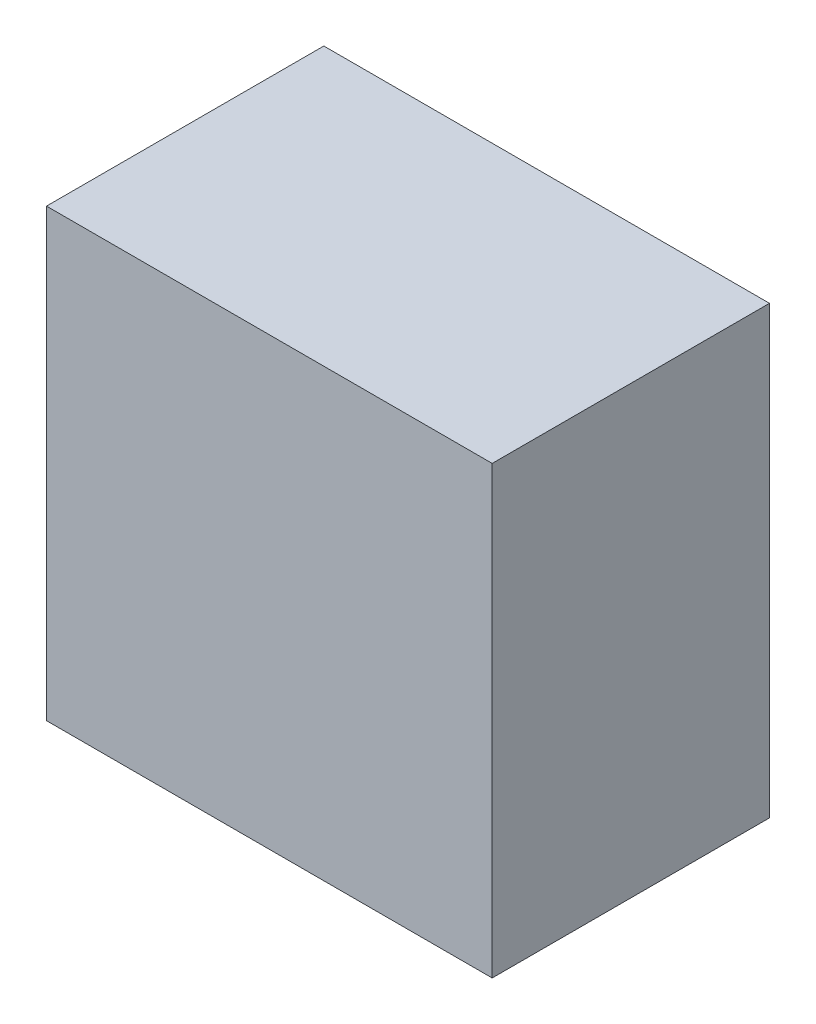
ISO-10303-21;
HEADER;
FILE_DESCRIPTION(('STEP AP214'),'2;1');
FILE_NAME('part.step','',(''),(''),'','','');
FILE_SCHEMA(('AUTOMOTIVE_DESIGN { 1 0 10303 214 1 1 1 1 }'));
ENDSEC;
DATA;
#1=APPLICATION_CONTEXT('core data for automotive mechanical design processes');
#2=APPLICATION_PROTOCOL_DEFINITION('international standard','automotive_design',2000,#1);
#3=PRODUCT_CONTEXT('',#1,'mechanical');
#4=PRODUCT('Part','Part','',(#3));
#5=PRODUCT_RELATED_PRODUCT_CATEGORY('part','',(#4));
#6=PRODUCT_DEFINITION_FORMATION('','',#4);
#7=PRODUCT_DEFINITION_CONTEXT('part definition',#1,'design');
#8=PRODUCT_DEFINITION('design','',#6,#7);
#9=PRODUCT_DEFINITION_SHAPE('','',#8);
#10=(LENGTH_UNIT() NAMED_UNIT(*) SI_UNIT(.MILLI.,.METRE.));
#11=(NAMED_UNIT(*) PLANE_ANGLE_UNIT() SI_UNIT($,.RADIAN.));
#12=(NAMED_UNIT(*) SI_UNIT($,.STERADIAN.) SOLID_ANGLE_UNIT());
#13=UNCERTAINTY_MEASURE_WITH_UNIT(LENGTH_MEASURE(1.E-05),#10,'distance_accuracy_value','');
#14=(GEOMETRIC_REPRESENTATION_CONTEXT(3) GLOBAL_UNCERTAINTY_ASSIGNED_CONTEXT((#13)) GLOBAL_UNIT_ASSIGNED_CONTEXT((#10,
#11,#12)) REPRESENTATION_CONTEXT('',''));
#15=CARTESIAN_POINT('',(0.,0.,0.));
#16=DIRECTION('',(0.,0.,1.));
#17=DIRECTION('',(1.,0.,0.));
#18=AXIS2_PLACEMENT_3D('',#15,#16,#17);
#19=CARTESIAN_POINT('',(-5.62500018,-5.62500018,7.00000124));
#20=DIRECTION('',(0.,0.,1.));
#21=DIRECTION('',(1.,0.,0.));
#22=AXIS2_PLACEMENT_3D('',#19,#20,#21);
#23=PLANE('',#22);
#24=DIRECTION('',(1.,0.,0.));
#25=VECTOR('',#24,1.);
#26=CARTESIAN_POINT('',(-5.62500018,5.62500018,7.00000124));
#27=LINE('',#26,#25);
#28=CARTESIAN_POINT('',(-5.62500018,5.62500018,7.00000124));
#29=VERTEX_POINT('',#28);
#30=CARTESIAN_POINT('',(5.62500018,5.62500018,7.00000124));
#31=VERTEX_POINT('',#30);
#32=EDGE_CURVE('E53',#29,#31,#27,.T.);
#33=ORIENTED_EDGE('',*,*,#32,.F.);
#34=DIRECTION('',(0.,1.,0.));
#35=VECTOR('',#34,1.);
#36=CARTESIAN_POINT('',(-5.62500018,-5.62500018,7.00000124));
#37=LINE('',#36,#35);
#38=CARTESIAN_POINT('',(-5.62500018,-5.62500018,7.00000124));
#39=VERTEX_POINT('',#38);
#40=EDGE_CURVE('E68',#39,#29,#37,.T.);
#41=ORIENTED_EDGE('',*,*,#40,.F.);
#42=DIRECTION('',(1.,0.,0.));
#43=VECTOR('',#42,1.);
#44=CARTESIAN_POINT('',(5.62500018,-5.62500018,7.00000124));
#45=LINE('',#44,#43);
#46=CARTESIAN_POINT('',(5.62500018,-5.62500018,7.00000124));
#47=VERTEX_POINT('',#46);
#48=EDGE_CURVE('E20',#47,#39,#45,.F.);
#49=ORIENTED_EDGE('',*,*,#48,.F.);
#50=DIRECTION('',(0.,1.,0.));
#51=VECTOR('',#50,1.);
#52=CARTESIAN_POINT('',(5.62500018,5.62500018,7.00000124));
#53=LINE('',#52,#51);
#54=EDGE_CURVE('E58',#31,#47,#53,.F.);
#55=ORIENTED_EDGE('',*,*,#54,.F.);
#56=EDGE_LOOP('',(#33,#41,#49,#55));
#57=FACE_BOUND('',#56,.T.);
#58=ADVANCED_FACE('F17',(#57),#23,.T.);
#59=CARTESIAN_POINT('',(5.62500018,-5.62500018,0.));
#60=DIRECTION('',(0.,-1.,0.));
#61=DIRECTION('',(0.,0.,-1.));
#62=AXIS2_PLACEMENT_3D('',#59,#60,#61);
#63=PLANE('',#62);
#64=DIRECTION('',(0.,0.,1.));
#65=VECTOR('',#64,1.);
#66=CARTESIAN_POINT('',(-5.62500018,-5.62500018,0.));
#67=LINE('',#66,#65);
#68=CARTESIAN_POINT('',(-5.62500018,-5.62500018,0.));
#69=VERTEX_POINT('',#68);
#70=EDGE_CURVE('E79',#69,#39,#67,.T.);
#71=ORIENTED_EDGE('',*,*,#70,.F.);
#72=DIRECTION('',(1.,0.,0.));
#73=VECTOR('',#72,1.);
#74=CARTESIAN_POINT('',(-5.62500018,-5.62500018,0.));
#75=LINE('',#74,#73);
#76=CARTESIAN_POINT('',(5.62500018,-5.62500018,0.));
#77=VERTEX_POINT('',#76);
#78=EDGE_CURVE('E74',#69,#77,#75,.T.);
#79=ORIENTED_EDGE('',*,*,#78,.T.);
#80=DIRECTION('',(0.,0.,-1.));
#81=VECTOR('',#80,1.);
#82=CARTESIAN_POINT('',(5.62500018,-5.62500018,0.));
#83=LINE('',#82,#81);
#84=EDGE_CURVE('E63',#47,#77,#83,.T.);
#85=ORIENTED_EDGE('',*,*,#84,.F.);
#86=ORIENTED_EDGE('',*,*,#48,.T.);
#87=EDGE_LOOP('',(#71,#79,#85,#86));
#88=FACE_BOUND('',#87,.T.);
#89=ADVANCED_FACE('F73',(#88),#63,.T.);
#90=CARTESIAN_POINT('',(5.62500018,5.62500018,0.));
#91=DIRECTION('',(1.,0.,0.));
#92=DIRECTION('',(0.,0.,-1.));
#93=AXIS2_PLACEMENT_3D('',#90,#91,#92);
#94=PLANE('',#93);
#95=ORIENTED_EDGE('',*,*,#84,.T.);
#96=DIRECTION('',(0.,1.,0.));
#97=VECTOR('',#96,1.);
#98=CARTESIAN_POINT('',(5.62500018,-5.62500018,0.));
#99=LINE('',#98,#97);
#100=CARTESIAN_POINT('',(5.62500018,5.62500018,0.));
#101=VERTEX_POINT('',#100);
#102=EDGE_CURVE('E84',#77,#101,#99,.T.);
#103=ORIENTED_EDGE('',*,*,#102,.T.);
#104=DIRECTION('',(0.,0.,1.));
#105=VECTOR('',#104,1.);
#106=CARTESIAN_POINT('',(5.62500018,5.62500018,0.));
#107=LINE('',#106,#105);
#108=EDGE_CURVE('E65',#31,#101,#107,.F.);
#109=ORIENTED_EDGE('',*,*,#108,.F.);
#110=ORIENTED_EDGE('',*,*,#54,.T.);
#111=EDGE_LOOP('',(#95,#103,#109,#110));
#112=FACE_BOUND('',#111,.T.);
#113=ADVANCED_FACE('F60',(#112),#94,.T.);
#114=CARTESIAN_POINT('',(-5.62500018,5.62500018,0.));
#115=DIRECTION('',(0.,1.,0.));
#116=DIRECTION('',(0.,0.,1.));
#117=AXIS2_PLACEMENT_3D('',#114,#115,#116);
#118=PLANE('',#117);
#119=ORIENTED_EDGE('',*,*,#108,.T.);
#120=DIRECTION('',(1.,0.,0.));
#121=VECTOR('',#120,1.);
#122=CARTESIAN_POINT('',(-5.62500018,5.62500018,0.));
#123=LINE('',#122,#121);
#124=CARTESIAN_POINT('',(-5.62500018,5.62500018,0.));
#125=VERTEX_POINT('',#124);
#126=EDGE_CURVE('E26',#101,#125,#123,.F.);
#127=ORIENTED_EDGE('',*,*,#126,.T.);
#128=DIRECTION('',(0.,0.,1.));
#129=VECTOR('',#128,1.);
#130=CARTESIAN_POINT('',(-5.62500018,5.62500018,0.));
#131=LINE('',#130,#129);
#132=EDGE_CURVE('E34',#29,#125,#131,.F.);
#133=ORIENTED_EDGE('',*,*,#132,.F.);
#134=ORIENTED_EDGE('',*,*,#32,.T.);
#135=EDGE_LOOP('',(#119,#127,#133,#134));
#136=FACE_BOUND('',#135,.T.);
#137=ADVANCED_FACE('F88',(#136),#118,.T.);
#138=CARTESIAN_POINT('',(-5.62500018,-5.62500018,0.));
#139=DIRECTION('',(-1.,0.,0.));
#140=DIRECTION('',(0.,0.,1.));
#141=AXIS2_PLACEMENT_3D('',#138,#139,#140);
#142=PLANE('',#141);
#143=ORIENTED_EDGE('',*,*,#132,.T.);
#144=DIRECTION('',(0.,1.,0.));
#145=VECTOR('',#144,1.);
#146=CARTESIAN_POINT('',(-5.62500018,-5.62500018,0.));
#147=LINE('',#146,#145);
#148=EDGE_CURVE('E11',#125,#69,#147,.F.);
#149=ORIENTED_EDGE('',*,*,#148,.T.);
#150=ORIENTED_EDGE('',*,*,#70,.T.);
#151=ORIENTED_EDGE('',*,*,#40,.T.);
#152=EDGE_LOOP('',(#143,#149,#150,#151));
#153=FACE_BOUND('',#152,.T.);
#154=ADVANCED_FACE('F91',(#153),#142,.T.);
#155=CARTESIAN_POINT('',(-5.62500018,-5.62500018,0.));
#156=DIRECTION('',(0.,0.,1.));
#157=DIRECTION('',(1.,0.,0.));
#158=AXIS2_PLACEMENT_3D('',#155,#156,#157);
#159=PLANE('',#158);
#160=ORIENTED_EDGE('',*,*,#126,.F.);
#161=ORIENTED_EDGE('',*,*,#102,.F.);
#162=ORIENTED_EDGE('',*,*,#78,.F.);
#163=ORIENTED_EDGE('',*,*,#148,.F.);
#164=EDGE_LOOP('',(#160,#161,#162,#163));
#165=FACE_BOUND('',#164,.T.);
#166=ADVANCED_FACE('F90',(#165),#159,.F.);
#167=CLOSED_SHELL('',(#58,#89,#113,#137,#154,#166));
#168=MANIFOLD_SOLID_BREP('B1',#167);
#169=ADVANCED_BREP_SHAPE_REPRESENTATION('',(#18,#168),#14);
#170=SHAPE_DEFINITION_REPRESENTATION(#9,#169);
ENDSEC;
END-ISO-10303-21;
